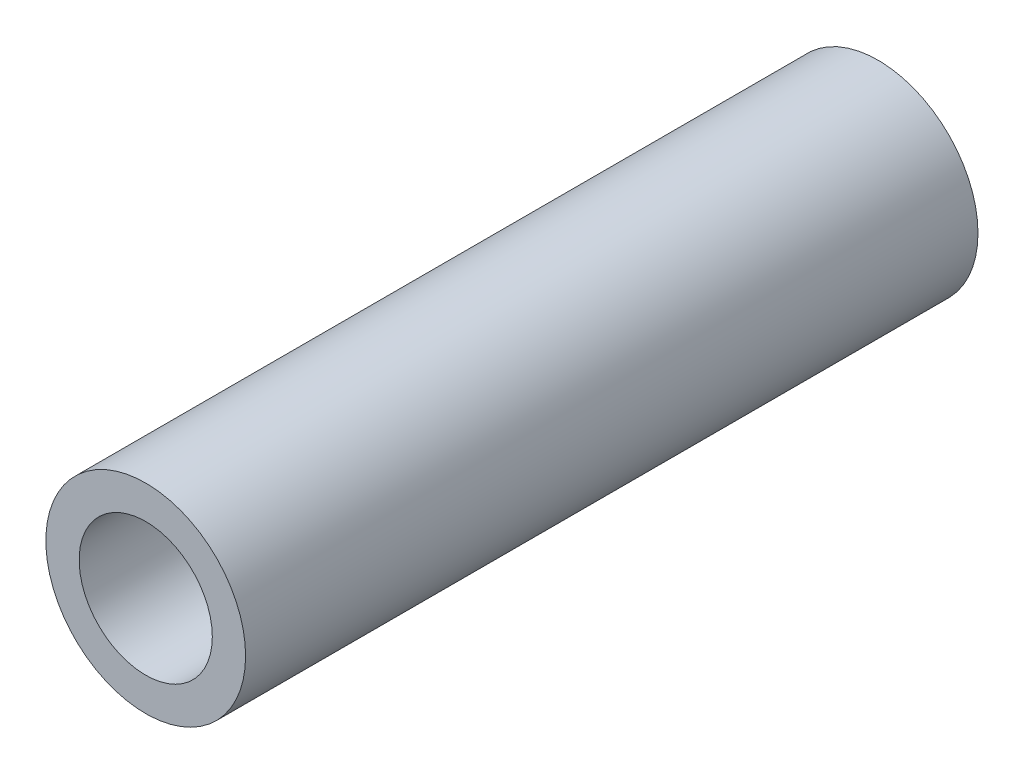
ISO-10303-21;
HEADER;
FILE_DESCRIPTION(('STEP AP214'),'2;1');
FILE_NAME('part.step','',(''),(''),'','','');
FILE_SCHEMA(('AUTOMOTIVE_DESIGN { 1 0 10303 214 1 1 1 1 }'));
ENDSEC;
DATA;
#1=APPLICATION_CONTEXT('core data for automotive mechanical design processes');
#2=APPLICATION_PROTOCOL_DEFINITION('international standard','automotive_design',2000,#1);
#3=PRODUCT_CONTEXT('',#1,'mechanical');
#4=PRODUCT('Part','Part','',(#3));
#5=PRODUCT_RELATED_PRODUCT_CATEGORY('part','',(#4));
#6=PRODUCT_DEFINITION_FORMATION('','',#4);
#7=PRODUCT_DEFINITION_CONTEXT('part definition',#1,'design');
#8=PRODUCT_DEFINITION('design','',#6,#7);
#9=PRODUCT_DEFINITION_SHAPE('','',#8);
#10=(LENGTH_UNIT() NAMED_UNIT(*) SI_UNIT(.MILLI.,.METRE.));
#11=(NAMED_UNIT(*) PLANE_ANGLE_UNIT() SI_UNIT($,.RADIAN.));
#12=(NAMED_UNIT(*) SI_UNIT($,.STERADIAN.) SOLID_ANGLE_UNIT());
#13=UNCERTAINTY_MEASURE_WITH_UNIT(LENGTH_MEASURE(1.E-05),#10,'distance_accuracy_value','');
#14=(GEOMETRIC_REPRESENTATION_CONTEXT(3) GLOBAL_UNCERTAINTY_ASSIGNED_CONTEXT((#13)) GLOBAL_UNIT_ASSIGNED_CONTEXT((#10,
#11,#12)) REPRESENTATION_CONTEXT('',''));
#15=CARTESIAN_POINT('',(0.,0.,0.));
#16=DIRECTION('',(0.,0.,1.));
#17=DIRECTION('',(1.,0.,0.));
#18=AXIS2_PLACEMENT_3D('',#15,#16,#17);
#19=CARTESIAN_POINT('',(0.,0.,275.));
#20=DIRECTION('',(0.,0.,1.));
#21=DIRECTION('',(1.,0.,0.));
#22=AXIS2_PLACEMENT_3D('',#19,#20,#21);
#23=PLANE('',#22);
#24=CARTESIAN_POINT('',(0.,0.,275.));
#25=DIRECTION('',(0.,0.,1.));
#26=DIRECTION('',(1.,0.,0.));
#27=AXIS2_PLACEMENT_3D('',#24,#25,#26);
#28=CIRCLE('',#27,37.5);
#29=CARTESIAN_POINT('',(37.5,0.,275.));
#30=VERTEX_POINT('',#29);
#31=EDGE_CURVE('E10',#30,#30,#28,.T.);
#32=ORIENTED_EDGE('',*,*,#31,.T.);
#33=EDGE_LOOP('',(#32));
#34=FACE_BOUND('',#33,.T.);
#35=CARTESIAN_POINT('',(0.,0.,275.));
#36=DIRECTION('',(0.,0.,1.));
#37=DIRECTION('',(1.,0.,0.));
#38=AXIS2_PLACEMENT_3D('',#35,#36,#37);
#39=CIRCLE('',#38,25.);
#40=CARTESIAN_POINT('',(25.,0.,275.));
#41=VERTEX_POINT('',#40);
#42=EDGE_CURVE('E50',#41,#41,#39,.T.);
#43=ORIENTED_EDGE('',*,*,#42,.F.);
#44=EDGE_LOOP('',(#43));
#45=FACE_BOUND('',#44,.T.);
#46=ADVANCED_FACE('F37',(#34,#45),#23,.T.);
#47=CARTESIAN_POINT('',(0.,0.,0.));
#48=DIRECTION('',(0.,0.,1.));
#49=DIRECTION('',(1.,0.,0.));
#50=AXIS2_PLACEMENT_3D('',#47,#48,#49);
#51=PLANE('',#50);
#52=CARTESIAN_POINT('',(0.,0.,0.));
#53=DIRECTION('',(0.,0.,1.));
#54=DIRECTION('',(1.,0.,0.));
#55=AXIS2_PLACEMENT_3D('',#52,#53,#54);
#56=CIRCLE('',#55,37.5);
#57=CARTESIAN_POINT('',(37.5,0.,0.));
#58=VERTEX_POINT('',#57);
#59=EDGE_CURVE('E41',#58,#58,#56,.T.);
#60=ORIENTED_EDGE('',*,*,#59,.F.);
#61=EDGE_LOOP('',(#60));
#62=FACE_BOUND('',#61,.T.);
#63=CARTESIAN_POINT('',(0.,0.,0.));
#64=DIRECTION('',(0.,0.,1.));
#65=DIRECTION('',(1.,0.,0.));
#66=AXIS2_PLACEMENT_3D('',#63,#64,#65);
#67=CIRCLE('',#66,25.);
#68=CARTESIAN_POINT('',(25.,0.,0.));
#69=VERTEX_POINT('',#68);
#70=EDGE_CURVE('E52',#69,#69,#67,.T.);
#71=ORIENTED_EDGE('',*,*,#70,.T.);
#72=EDGE_LOOP('',(#71));
#73=FACE_BOUND('',#72,.T.);
#74=ADVANCED_FACE('F64',(#62,#73),#51,.F.);
#75=CARTESIAN_POINT('',(0.,0.,275.));
#76=DIRECTION('',(0.,0.,-1.));
#77=DIRECTION('',(-1.,0.,0.));
#78=AXIS2_PLACEMENT_3D('',#75,#76,#77);
#79=CYLINDRICAL_SURFACE('',#78,37.5);
#80=ORIENTED_EDGE('',*,*,#31,.F.);
#81=EDGE_LOOP('',(#80));
#82=FACE_BOUND('',#81,.T.);
#83=ORIENTED_EDGE('',*,*,#59,.T.);
#84=EDGE_LOOP('',(#83));
#85=FACE_BOUND('',#84,.T.);
#86=ADVANCED_FACE('F39',(#82,#85),#79,.T.);
#87=CARTESIAN_POINT('',(0.,0.,275.));
#88=DIRECTION('',(0.,0.,-1.));
#89=DIRECTION('',(-1.,0.,0.));
#90=AXIS2_PLACEMENT_3D('',#87,#88,#89);
#91=CYLINDRICAL_SURFACE('',#90,25.);
#92=ORIENTED_EDGE('',*,*,#42,.T.);
#93=EDGE_LOOP('',(#92));
#94=FACE_BOUND('',#93,.T.);
#95=ORIENTED_EDGE('',*,*,#70,.F.);
#96=EDGE_LOOP('',(#95));
#97=FACE_BOUND('',#96,.T.);
#98=ADVANCED_FACE('F60',(#94,#97),#91,.F.);
#99=CLOSED_SHELL('',(#46,#74,#86,#98));
#100=MANIFOLD_SOLID_BREP('B2',#99);
#101=ADVANCED_BREP_SHAPE_REPRESENTATION('',(#18,#100),#14);
#102=SHAPE_DEFINITION_REPRESENTATION(#9,#101);
ENDSEC;
END-ISO-10303-21;
